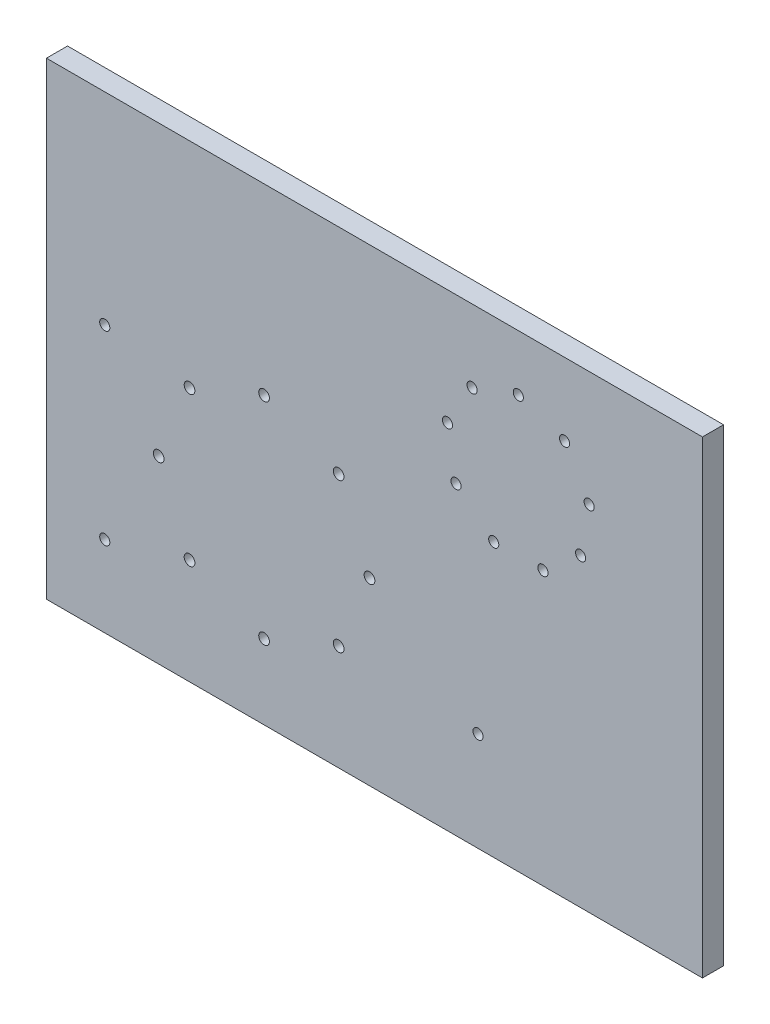
ISO-10303-21;
HEADER;
FILE_DESCRIPTION(('STEP AP214'),'2;1');
FILE_NAME('part.step','',(''),(''),'','','');
FILE_SCHEMA(('AUTOMOTIVE_DESIGN { 1 0 10303 214 1 1 1 1 }'));
ENDSEC;
DATA;
#1=APPLICATION_CONTEXT('core data for automotive mechanical design processes');
#2=APPLICATION_PROTOCOL_DEFINITION('international standard','automotive_design',2000,#1);
#3=PRODUCT_CONTEXT('',#1,'mechanical');
#4=PRODUCT('Part','Part','',(#3));
#5=PRODUCT_RELATED_PRODUCT_CATEGORY('part','',(#4));
#6=PRODUCT_DEFINITION_FORMATION('','',#4);
#7=PRODUCT_DEFINITION_CONTEXT('part definition',#1,'design');
#8=PRODUCT_DEFINITION('design','',#6,#7);
#9=PRODUCT_DEFINITION_SHAPE('','',#8);
#10=(LENGTH_UNIT() NAMED_UNIT(*) SI_UNIT(.MILLI.,.METRE.));
#11=(NAMED_UNIT(*) PLANE_ANGLE_UNIT() SI_UNIT($,.RADIAN.));
#12=(NAMED_UNIT(*) SI_UNIT($,.STERADIAN.) SOLID_ANGLE_UNIT());
#13=UNCERTAINTY_MEASURE_WITH_UNIT(LENGTH_MEASURE(1.E-05),#10,'distance_accuracy_value','');
#14=(GEOMETRIC_REPRESENTATION_CONTEXT(3) GLOBAL_UNCERTAINTY_ASSIGNED_CONTEXT((#13)) GLOBAL_UNIT_ASSIGNED_CONTEXT((#10,
#11,#12)) REPRESENTATION_CONTEXT('',''));
#15=CARTESIAN_POINT('',(0.,0.,0.));
#16=DIRECTION('',(0.,0.,1.));
#17=DIRECTION('',(1.,0.,0.));
#18=AXIS2_PLACEMENT_3D('',#15,#16,#17);
#19=CARTESIAN_POINT('',(0.,0.,0.));
#20=DIRECTION('',(0.,0.,1.));
#21=DIRECTION('',(1.,0.,0.));
#22=AXIS2_PLACEMENT_3D('',#19,#20,#21);
#23=PLANE('',#22);
#24=CARTESIAN_POINT('',(31.6090022979574,43.8536444541418,0.));
#25=DIRECTION('',(0.,0.,1.));
#26=DIRECTION('',(1.,0.,0.));
#27=AXIS2_PLACEMENT_3D('',#24,#25,#26);
#28=CIRCLE('',#27,2.74999999999999);
#29=CARTESIAN_POINT('',(34.3590022979574,43.8536444541418,0.));
#30=VERTEX_POINT('',#29);
#31=EDGE_CURVE('E276',#30,#30,#28,.T.);
#32=ORIENTED_EDGE('',*,*,#31,.T.);
#33=EDGE_LOOP('',(#32));
#34=FACE_BOUND('',#33,.T.);
#35=CARTESIAN_POINT('',(31.6090022979574,144.599742174142,0.));
#36=DIRECTION('',(0.,0.,1.));
#37=DIRECTION('',(1.,0.,0.));
#38=AXIS2_PLACEMENT_3D('',#35,#36,#37);
#39=CIRCLE('',#38,2.74999999999999);
#40=CARTESIAN_POINT('',(34.3590022979574,144.599742174142,0.));
#41=VERTEX_POINT('',#40);
#42=EDGE_CURVE('E286',#41,#41,#39,.T.);
#43=ORIENTED_EDGE('',*,*,#42,.T.);
#44=EDGE_LOOP('',(#43));
#45=FACE_BOUND('',#44,.T.);
#46=CARTESIAN_POINT('',(233.918988075957,53.7453572081418,0.));
#47=DIRECTION('',(0.,0.,1.));
#48=DIRECTION('',(1.,0.,0.));
#49=AXIS2_PLACEMENT_3D('',#46,#47,#48);
#50=CIRCLE('',#49,2.74999999999997);
#51=CARTESIAN_POINT('',(236.668988075957,53.7453572081418,0.));
#52=VERTEX_POINT('',#51);
#53=EDGE_CURVE('E292',#52,#52,#50,.T.);
#54=ORIENTED_EDGE('',*,*,#53,.T.);
#55=EDGE_LOOP('',(#54));
#56=FACE_BOUND('',#55,.T.);
#57=CARTESIAN_POINT('',(255.781782297957,223.823644432142,0.));
#58=DIRECTION('',(0.,0.,1.));
#59=DIRECTION('',(1.,0.,0.));
#60=AXIS2_PLACEMENT_3D('',#57,#58,#59);
#61=CIRCLE('',#60,2.74999999999997);
#62=CARTESIAN_POINT('',(258.531782297957,223.823644432142,0.));
#63=VERTEX_POINT('',#62);
#64=EDGE_CURVE('E298',#63,#63,#61,.T.);
#65=ORIENTED_EDGE('',*,*,#64,.T.);
#66=EDGE_LOOP('',(#65));
#67=FACE_BOUND('',#66,.T.);
#68=CARTESIAN_POINT('',(280.850499061592,214.699377718931,0.));
#69=DIRECTION('',(0.,0.,1.));
#70=DIRECTION('',(1.,0.,0.));
#71=AXIS2_PLACEMENT_3D('',#68,#69,#70);
#72=CIRCLE('',#71,2.74999999999997);
#73=CARTESIAN_POINT('',(283.600499061592,214.699377718931,0.));
#74=VERTEX_POINT('',#73);
#75=EDGE_CURVE('E304',#74,#74,#72,.T.);
#76=ORIENTED_EDGE('',*,*,#75,.T.);
#77=EDGE_LOOP('',(#76));
#78=FACE_BOUND('',#77,.T.);
#79=CARTESIAN_POINT('',(294.189284643768,191.595923379332,0.));
#80=DIRECTION('',(0.,0.,1.));
#81=DIRECTION('',(1.,0.,0.));
#82=AXIS2_PLACEMENT_3D('',#79,#80,#81);
#83=CIRCLE('',#82,2.74999999999997);
#84=CARTESIAN_POINT('',(296.939284643768,191.595923379332,0.));
#85=VERTEX_POINT('',#84);
#86=EDGE_CURVE('E310',#85,#85,#83,.T.);
#87=ORIENTED_EDGE('',*,*,#86,.T.);
#88=EDGE_LOOP('',(#87));
#89=FACE_BOUND('',#88,.T.);
#90=CARTESIAN_POINT('',(289.556773026498,165.323644465142,0.));
#91=DIRECTION('',(0.,0.,1.));
#92=DIRECTION('',(1.,0.,0.));
#93=AXIS2_PLACEMENT_3D('',#90,#91,#92);
#94=CIRCLE('',#93,2.74999999999997);
#95=CARTESIAN_POINT('',(292.306773026498,165.323644465142,0.));
#96=VERTEX_POINT('',#95);
#97=EDGE_CURVE('E316',#96,#96,#94,.T.);
#98=ORIENTED_EDGE('',*,*,#97,.T.);
#99=EDGE_LOOP('',(#98));
#100=FACE_BOUND('',#99,.T.);
#101=CARTESIAN_POINT('',(269.120567880134,148.175632264165,0.));
#102=DIRECTION('',(0.,0.,1.));
#103=DIRECTION('',(1.,0.,0.));
#104=AXIS2_PLACEMENT_3D('',#101,#102,#103);
#105=CIRCLE('',#104,2.74999999999997);
#106=CARTESIAN_POINT('',(271.870567880134,148.175632264165,0.));
#107=VERTEX_POINT('',#106);
#108=EDGE_CURVE('E322',#107,#107,#105,.T.);
#109=ORIENTED_EDGE('',*,*,#108,.T.);
#110=EDGE_LOOP('',(#109));
#111=FACE_BOUND('',#110,.T.);
#112=CARTESIAN_POINT('',(242.442996715781,148.175632264165,0.));
#113=DIRECTION('',(0.,0.,1.));
#114=DIRECTION('',(1.,0.,0.));
#115=AXIS2_PLACEMENT_3D('',#112,#113,#114);
#116=CIRCLE('',#115,2.74999999999997);
#117=CARTESIAN_POINT('',(245.192996715781,148.175632264165,0.));
#118=VERTEX_POINT('',#117);
#119=EDGE_CURVE('E328',#118,#118,#116,.T.);
#120=ORIENTED_EDGE('',*,*,#119,.T.);
#121=EDGE_LOOP('',(#120));
#122=FACE_BOUND('',#121,.T.);
#123=CARTESIAN_POINT('',(222.006791569417,165.323644465142,0.));
#124=DIRECTION('',(0.,0.,1.));
#125=DIRECTION('',(1.,0.,0.));
#126=AXIS2_PLACEMENT_3D('',#123,#124,#125);
#127=CIRCLE('',#126,2.74999999999997);
#128=CARTESIAN_POINT('',(224.756791569417,165.323644465142,0.));
#129=VERTEX_POINT('',#128);
#130=EDGE_CURVE('E334',#129,#129,#127,.T.);
#131=ORIENTED_EDGE('',*,*,#130,.T.);
#132=EDGE_LOOP('',(#131));
#133=FACE_BOUND('',#132,.T.);
#134=CARTESIAN_POINT('',(217.374279952147,191.595923379332,0.));
#135=DIRECTION('',(0.,0.,1.));
#136=DIRECTION('',(1.,0.,0.));
#137=AXIS2_PLACEMENT_3D('',#134,#135,#136);
#138=CIRCLE('',#137,2.74999999999997);
#139=CARTESIAN_POINT('',(220.124279952147,191.595923379332,0.));
#140=VERTEX_POINT('',#139);
#141=EDGE_CURVE('E340',#140,#140,#138,.T.);
#142=ORIENTED_EDGE('',*,*,#141,.T.);
#143=EDGE_LOOP('',(#142));
#144=FACE_BOUND('',#143,.T.);
#145=CARTESIAN_POINT('',(230.713065534325,214.699377718927,0.));
#146=DIRECTION('',(0.,0.,1.));
#147=DIRECTION('',(1.,0.,0.));
#148=AXIS2_PLACEMENT_3D('',#145,#146,#147);
#149=CIRCLE('',#148,2.74999999999997);
#150=CARTESIAN_POINT('',(233.463065534325,214.699377718927,0.));
#151=VERTEX_POINT('',#150);
#152=EDGE_CURVE('E346',#151,#151,#149,.T.);
#153=ORIENTED_EDGE('',*,*,#152,.T.);
#154=EDGE_LOOP('',(#153));
#155=FACE_BOUND('',#154,.T.);
#156=CARTESIAN_POINT('',(158.38015484277,138.036274418956,0.));
#157=DIRECTION('',(0.,0.,-1.));
#158=DIRECTION('',(-1.,0.,0.));
#159=AXIS2_PLACEMENT_3D('',#156,#157,#158);
#160=CIRCLE('',#159,6.11999999999999);
#161=CARTESIAN_POINT('',(152.26015484277,138.036274418956,0.));
#162=VERTEX_POINT('',#161);
#163=EDGE_CURVE('E349',#162,#162,#160,.T.);
#164=ORIENTED_EDGE('',*,*,#163,.F.);
#165=EDGE_LOOP('',(#164));
#166=FACE_BOUND('',#165,.T.);
#167=CARTESIAN_POINT('',(117.969002297957,154.775121874142,0.));
#168=DIRECTION('',(0.,0.,-1.));
#169=DIRECTION('',(-1.,0.,0.));
#170=AXIS2_PLACEMENT_3D('',#167,#168,#169);
#171=CIRCLE('',#170,6.12);
#172=CARTESIAN_POINT('',(111.849002297957,154.775121874142,0.));
#173=VERTEX_POINT('',#172);
#174=EDGE_CURVE('E361',#173,#173,#171,.T.);
#175=ORIENTED_EDGE('',*,*,#174,.F.);
#176=EDGE_LOOP('',(#175));
#177=FACE_BOUND('',#176,.T.);
#178=CARTESIAN_POINT('',(77.5578497531479,138.036274418951,0.));
#179=DIRECTION('',(0.,0.,-1.));
#180=DIRECTION('',(-1.,0.,0.));
#181=AXIS2_PLACEMENT_3D('',#178,#179,#180);
#182=CIRCLE('',#181,6.12);
#183=CARTESIAN_POINT('',(71.4378497531479,138.036274418951,0.));
#184=VERTEX_POINT('',#183);
#185=EDGE_CURVE('E373',#184,#184,#182,.T.);
#186=ORIENTED_EDGE('',*,*,#185,.F.);
#187=EDGE_LOOP('',(#186));
#188=FACE_BOUND('',#187,.T.);
#189=CARTESIAN_POINT('',(77.5578497531529,57.2139693293281,0.));
#190=DIRECTION('',(0.,0.,-1.));
#191=DIRECTION('',(-1.,0.,0.));
#192=AXIS2_PLACEMENT_3D('',#189,#190,#191);
#193=CIRCLE('',#192,6.12);
#194=CARTESIAN_POINT('',(71.4378497531529,57.2139693293281,0.));
#195=VERTEX_POINT('',#194);
#196=EDGE_CURVE('E397',#195,#195,#193,.T.);
#197=ORIENTED_EDGE('',*,*,#196,.F.);
#198=EDGE_LOOP('',(#197));
#199=FACE_BOUND('',#198,.T.);
#200=CARTESIAN_POINT('',(117.969002297965,40.4751218741419,0.));
#201=DIRECTION('',(0.,0.,-1.));
#202=DIRECTION('',(-1.,0.,0.));
#203=AXIS2_PLACEMENT_3D('',#200,#201,#202);
#204=CIRCLE('',#203,6.12);
#205=CARTESIAN_POINT('',(111.849002297965,40.4751218741419,0.));
#206=VERTEX_POINT('',#205);
#207=EDGE_CURVE('E409',#206,#206,#204,.T.);
#208=ORIENTED_EDGE('',*,*,#207,.F.);
#209=EDGE_LOOP('',(#208));
#210=FACE_BOUND('',#209,.T.);
#211=CARTESIAN_POINT('',(158.380154842775,57.2139693293333,0.));
#212=DIRECTION('',(0.,0.,-1.));
#213=DIRECTION('',(-1.,0.,0.));
#214=AXIS2_PLACEMENT_3D('',#211,#212,#213);
#215=CIRCLE('',#214,6.11999999999999);
#216=CARTESIAN_POINT('',(152.260154842775,57.2139693293333,0.));
#217=VERTEX_POINT('',#216);
#218=EDGE_CURVE('E421',#217,#217,#215,.T.);
#219=ORIENTED_EDGE('',*,*,#218,.F.);
#220=EDGE_LOOP('',(#219));
#221=FACE_BOUND('',#220,.T.);
#222=CARTESIAN_POINT('',(175.119002297961,97.6251218741457,0.));
#223=DIRECTION('',(0.,0.,-1.));
#224=DIRECTION('',(-1.,0.,0.));
#225=AXIS2_PLACEMENT_3D('',#222,#223,#224);
#226=CIRCLE('',#225,6.11999999999999);
#227=CARTESIAN_POINT('',(168.999002297961,97.6251218741457,0.));
#228=VERTEX_POINT('',#227);
#229=EDGE_CURVE('E433',#228,#228,#226,.T.);
#230=ORIENTED_EDGE('',*,*,#229,.F.);
#231=EDGE_LOOP('',(#230));
#232=FACE_BOUND('',#231,.T.);
#233=DIRECTION('',(1.,0.,0.));
#234=VECTOR('',#233,1.);
#235=CARTESIAN_POINT('',(0.,254.,0.));
#236=LINE('',#235,#234);
#237=CARTESIAN_POINT('',(0.,254.,0.));
#238=VERTEX_POINT('',#237);
#239=CARTESIAN_POINT('',(355.6,254.,0.));
#240=VERTEX_POINT('',#239);
#241=EDGE_CURVE('E99',#238,#240,#236,.T.);
#242=ORIENTED_EDGE('',*,*,#241,.T.);
#243=DIRECTION('',(0.,1.,0.));
#244=VECTOR('',#243,1.);
#245=CARTESIAN_POINT('',(355.6,0.,0.));
#246=LINE('',#245,#244);
#247=CARTESIAN_POINT('',(355.6,0.,0.));
#248=VERTEX_POINT('',#247);
#249=EDGE_CURVE('E102',#248,#240,#246,.T.);
#250=ORIENTED_EDGE('',*,*,#249,.F.);
#251=DIRECTION('',(1.,0.,0.));
#252=VECTOR('',#251,1.);
#253=CARTESIAN_POINT('',(0.,0.,0.));
#254=LINE('',#253,#252);
#255=CARTESIAN_POINT('',(0.,0.,0.));
#256=VERTEX_POINT('',#255);
#257=EDGE_CURVE('E87',#256,#248,#254,.T.);
#258=ORIENTED_EDGE('',*,*,#257,.F.);
#259=DIRECTION('',(0.,1.,0.));
#260=VECTOR('',#259,1.);
#261=CARTESIAN_POINT('',(0.,0.,0.));
#262=LINE('',#261,#260);
#263=EDGE_CURVE('E94',#256,#238,#262,.T.);
#264=ORIENTED_EDGE('',*,*,#263,.T.);
#265=EDGE_LOOP('',(#242,#250,#258,#264));
#266=FACE_BOUND('',#265,.T.);
#267=CARTESIAN_POINT('',(60.8190022979615,97.6251218741384,0.));
#268=DIRECTION('',(0.,0.,-1.));
#269=DIRECTION('',(-1.,0.,0.));
#270=AXIS2_PLACEMENT_3D('',#267,#268,#269);
#271=CIRCLE('',#270,6.12);
#272=CARTESIAN_POINT('',(54.6990022979615,97.6251218741384,0.));
#273=VERTEX_POINT('',#272);
#274=EDGE_CURVE('E385',#273,#273,#271,.T.);
#275=ORIENTED_EDGE('',*,*,#274,.F.);
#276=EDGE_LOOP('',(#275));
#277=FACE_BOUND('',#276,.T.);
#278=ADVANCED_FACE('F33',(#34,#45,#56,#67,#78,#89,#100,#111,#122,#133,#144,#155,#166,#177,#188,
#199,#210,#221,#232,#266,#277),#23,.F.);
#279=CARTESIAN_POINT('',(0.,254.,11.43));
#280=DIRECTION('',(0.,1.,0.));
#281=DIRECTION('',(0.,0.,1.));
#282=AXIS2_PLACEMENT_3D('',#279,#280,#281);
#283=PLANE('',#282);
#284=ORIENTED_EDGE('',*,*,#241,.F.);
#285=DIRECTION('',(0.,0.,-1.));
#286=VECTOR('',#285,1.);
#287=CARTESIAN_POINT('',(0.,254.,11.43));
#288=LINE('',#287,#286);
#289=CARTESIAN_POINT('',(0.,254.,11.43));
#290=VERTEX_POINT('',#289);
#291=EDGE_CURVE('E11',#290,#238,#288,.T.);
#292=ORIENTED_EDGE('',*,*,#291,.F.);
#293=DIRECTION('',(1.,0.,0.));
#294=VECTOR('',#293,1.);
#295=CARTESIAN_POINT('',(0.,254.,11.43));
#296=LINE('',#295,#294);
#297=CARTESIAN_POINT('',(355.6,254.,11.43));
#298=VERTEX_POINT('',#297);
#299=EDGE_CURVE('E92',#290,#298,#296,.T.);
#300=ORIENTED_EDGE('',*,*,#299,.T.);
#301=DIRECTION('',(0.,0.,-1.));
#302=VECTOR('',#301,1.);
#303=CARTESIAN_POINT('',(355.6,254.,11.43));
#304=LINE('',#303,#302);
#305=EDGE_CURVE('E37',#298,#240,#304,.T.);
#306=ORIENTED_EDGE('',*,*,#305,.T.);
#307=EDGE_LOOP('',(#284,#292,#300,#306));
#308=FACE_BOUND('',#307,.T.);
#309=ADVANCED_FACE('F35',(#308),#283,.T.);
#310=CARTESIAN_POINT('',(0.,0.,11.43));
#311=DIRECTION('',(-1.,0.,0.));
#312=DIRECTION('',(0.,0.,1.));
#313=AXIS2_PLACEMENT_3D('',#310,#311,#312);
#314=PLANE('',#313);
#315=ORIENTED_EDGE('',*,*,#263,.F.);
#316=DIRECTION('',(0.,0.,-1.));
#317=VECTOR('',#316,1.);
#318=CARTESIAN_POINT('',(0.,0.,11.43));
#319=LINE('',#318,#317);
#320=CARTESIAN_POINT('',(0.,0.,11.43));
#321=VERTEX_POINT('',#320);
#322=EDGE_CURVE('E43',#321,#256,#319,.T.);
#323=ORIENTED_EDGE('',*,*,#322,.F.);
#324=DIRECTION('',(0.,1.,0.));
#325=VECTOR('',#324,1.);
#326=CARTESIAN_POINT('',(0.,0.,11.43));
#327=LINE('',#326,#325);
#328=EDGE_CURVE('E82',#321,#290,#327,.T.);
#329=ORIENTED_EDGE('',*,*,#328,.T.);
#330=ORIENTED_EDGE('',*,*,#291,.T.);
#331=EDGE_LOOP('',(#315,#323,#329,#330));
#332=FACE_BOUND('',#331,.T.);
#333=ADVANCED_FACE('F110',(#332),#314,.T.);
#334=CARTESIAN_POINT('',(0.,0.,11.43));
#335=DIRECTION('',(0.,1.,0.));
#336=DIRECTION('',(0.,0.,1.));
#337=AXIS2_PLACEMENT_3D('',#334,#335,#336);
#338=PLANE('',#337);
#339=ORIENTED_EDGE('',*,*,#257,.T.);
#340=DIRECTION('',(0.,0.,-1.));
#341=VECTOR('',#340,1.);
#342=CARTESIAN_POINT('',(355.6,0.,11.43));
#343=LINE('',#342,#341);
#344=CARTESIAN_POINT('',(355.6,0.,11.43));
#345=VERTEX_POINT('',#344);
#346=EDGE_CURVE('E85',#345,#248,#343,.T.);
#347=ORIENTED_EDGE('',*,*,#346,.F.);
#348=DIRECTION('',(1.,0.,0.));
#349=VECTOR('',#348,1.);
#350=CARTESIAN_POINT('',(0.,0.,11.43));
#351=LINE('',#350,#349);
#352=EDGE_CURVE('E79',#321,#345,#351,.T.);
#353=ORIENTED_EDGE('',*,*,#352,.F.);
#354=ORIENTED_EDGE('',*,*,#322,.T.);
#355=EDGE_LOOP('',(#339,#347,#353,#354));
#356=FACE_BOUND('',#355,.T.);
#357=ADVANCED_FACE('F86',(#356),#338,.F.);
#358=CARTESIAN_POINT('',(355.6,0.,11.43));
#359=DIRECTION('',(-1.,0.,0.));
#360=DIRECTION('',(0.,-1.,0.));
#361=AXIS2_PLACEMENT_3D('',#358,#359,#360);
#362=PLANE('',#361);
#363=ORIENTED_EDGE('',*,*,#249,.T.);
#364=ORIENTED_EDGE('',*,*,#305,.F.);
#365=DIRECTION('',(0.,1.,0.));
#366=VECTOR('',#365,1.);
#367=CARTESIAN_POINT('',(355.6,0.,11.43));
#368=LINE('',#367,#366);
#369=EDGE_CURVE('E76',#345,#298,#368,.T.);
#370=ORIENTED_EDGE('',*,*,#369,.F.);
#371=ORIENTED_EDGE('',*,*,#346,.T.);
#372=EDGE_LOOP('',(#363,#364,#370,#371));
#373=FACE_BOUND('',#372,.T.);
#374=ADVANCED_FACE('F91',(#373),#362,.F.);
#375=CARTESIAN_POINT('',(0.,0.,11.43));
#376=DIRECTION('',(0.,0.,1.));
#377=DIRECTION('',(1.,0.,0.));
#378=AXIS2_PLACEMENT_3D('',#375,#376,#377);
#379=PLANE('',#378);
#380=CARTESIAN_POINT('',(31.6090022979574,43.8536444541418,11.43));
#381=DIRECTION('',(0.,0.,1.));
#382=DIRECTION('',(1.,0.,0.));
#383=AXIS2_PLACEMENT_3D('',#380,#381,#382);
#384=CIRCLE('',#383,2.74999999999999);
#385=CARTESIAN_POINT('',(34.3590022979574,43.8536444541418,11.43));
#386=VERTEX_POINT('',#385);
#387=EDGE_CURVE('E279',#386,#386,#384,.T.);
#388=ORIENTED_EDGE('',*,*,#387,.F.);
#389=EDGE_LOOP('',(#388));
#390=FACE_BOUND('',#389,.T.);
#391=CARTESIAN_POINT('',(31.6090022979574,144.599742174142,11.43));
#392=DIRECTION('',(0.,0.,1.));
#393=DIRECTION('',(1.,0.,0.));
#394=AXIS2_PLACEMENT_3D('',#391,#392,#393);
#395=CIRCLE('',#394,2.74999999999999);
#396=CARTESIAN_POINT('',(34.3590022979574,144.599742174142,11.43));
#397=VERTEX_POINT('',#396);
#398=EDGE_CURVE('E281',#397,#397,#395,.T.);
#399=ORIENTED_EDGE('',*,*,#398,.F.);
#400=EDGE_LOOP('',(#399));
#401=FACE_BOUND('',#400,.T.);
#402=CARTESIAN_POINT('',(233.918988075957,53.7453572081418,11.43));
#403=DIRECTION('',(0.,0.,1.));
#404=DIRECTION('',(1.,0.,0.));
#405=AXIS2_PLACEMENT_3D('',#402,#403,#404);
#406=CIRCLE('',#405,2.75);
#407=CARTESIAN_POINT('',(236.668988075957,53.7453572081418,11.43));
#408=VERTEX_POINT('',#407);
#409=EDGE_CURVE('E289',#408,#408,#406,.T.);
#410=ORIENTED_EDGE('',*,*,#409,.F.);
#411=EDGE_LOOP('',(#410));
#412=FACE_BOUND('',#411,.T.);
#413=CARTESIAN_POINT('',(255.781782297957,223.823644432142,11.43));
#414=DIRECTION('',(0.,0.,1.));
#415=DIRECTION('',(1.,0.,0.));
#416=AXIS2_PLACEMENT_3D('',#413,#414,#415);
#417=CIRCLE('',#416,2.74999999999997);
#418=CARTESIAN_POINT('',(258.531782297957,223.823644432142,11.43));
#419=VERTEX_POINT('',#418);
#420=EDGE_CURVE('E295',#419,#419,#417,.T.);
#421=ORIENTED_EDGE('',*,*,#420,.F.);
#422=EDGE_LOOP('',(#421));
#423=FACE_BOUND('',#422,.T.);
#424=CARTESIAN_POINT('',(280.850499061592,214.699377718931,11.43));
#425=DIRECTION('',(0.,0.,1.));
#426=DIRECTION('',(1.,0.,0.));
#427=AXIS2_PLACEMENT_3D('',#424,#425,#426);
#428=CIRCLE('',#427,2.74999999999997);
#429=CARTESIAN_POINT('',(283.600499061592,214.699377718931,11.43));
#430=VERTEX_POINT('',#429);
#431=EDGE_CURVE('E301',#430,#430,#428,.T.);
#432=ORIENTED_EDGE('',*,*,#431,.F.);
#433=EDGE_LOOP('',(#432));
#434=FACE_BOUND('',#433,.T.);
#435=CARTESIAN_POINT('',(294.189284643768,191.595923379332,11.43));
#436=DIRECTION('',(0.,0.,1.));
#437=DIRECTION('',(1.,0.,0.));
#438=AXIS2_PLACEMENT_3D('',#435,#436,#437);
#439=CIRCLE('',#438,2.74999999999997);
#440=CARTESIAN_POINT('',(296.939284643768,191.595923379332,11.43));
#441=VERTEX_POINT('',#440);
#442=EDGE_CURVE('E307',#441,#441,#439,.T.);
#443=ORIENTED_EDGE('',*,*,#442,.F.);
#444=EDGE_LOOP('',(#443));
#445=FACE_BOUND('',#444,.T.);
#446=CARTESIAN_POINT('',(289.556773026498,165.323644465142,11.43));
#447=DIRECTION('',(0.,0.,1.));
#448=DIRECTION('',(1.,0.,0.));
#449=AXIS2_PLACEMENT_3D('',#446,#447,#448);
#450=CIRCLE('',#449,2.74999999999997);
#451=CARTESIAN_POINT('',(292.306773026498,165.323644465142,11.43));
#452=VERTEX_POINT('',#451);
#453=EDGE_CURVE('E313',#452,#452,#450,.T.);
#454=ORIENTED_EDGE('',*,*,#453,.F.);
#455=EDGE_LOOP('',(#454));
#456=FACE_BOUND('',#455,.T.);
#457=CARTESIAN_POINT('',(269.120567880134,148.175632264165,11.43));
#458=DIRECTION('',(0.,0.,1.));
#459=DIRECTION('',(1.,0.,0.));
#460=AXIS2_PLACEMENT_3D('',#457,#458,#459);
#461=CIRCLE('',#460,2.74999999999997);
#462=CARTESIAN_POINT('',(271.870567880134,148.175632264165,11.43));
#463=VERTEX_POINT('',#462);
#464=EDGE_CURVE('E319',#463,#463,#461,.T.);
#465=ORIENTED_EDGE('',*,*,#464,.F.);
#466=EDGE_LOOP('',(#465));
#467=FACE_BOUND('',#466,.T.);
#468=CARTESIAN_POINT('',(242.442996715781,148.175632264165,11.43));
#469=DIRECTION('',(0.,0.,1.));
#470=DIRECTION('',(1.,0.,0.));
#471=AXIS2_PLACEMENT_3D('',#468,#469,#470);
#472=CIRCLE('',#471,2.74999999999997);
#473=CARTESIAN_POINT('',(245.192996715781,148.175632264165,11.43));
#474=VERTEX_POINT('',#473);
#475=EDGE_CURVE('E325',#474,#474,#472,.T.);
#476=ORIENTED_EDGE('',*,*,#475,.F.);
#477=EDGE_LOOP('',(#476));
#478=FACE_BOUND('',#477,.T.);
#479=CARTESIAN_POINT('',(222.006791569417,165.323644465142,11.43));
#480=DIRECTION('',(0.,0.,1.));
#481=DIRECTION('',(1.,0.,0.));
#482=AXIS2_PLACEMENT_3D('',#479,#480,#481);
#483=CIRCLE('',#482,2.74999999999997);
#484=CARTESIAN_POINT('',(224.756791569417,165.323644465142,11.43));
#485=VERTEX_POINT('',#484);
#486=EDGE_CURVE('E331',#485,#485,#483,.T.);
#487=ORIENTED_EDGE('',*,*,#486,.F.);
#488=EDGE_LOOP('',(#487));
#489=FACE_BOUND('',#488,.T.);
#490=CARTESIAN_POINT('',(217.374279952147,191.595923379332,11.43));
#491=DIRECTION('',(0.,0.,1.));
#492=DIRECTION('',(1.,0.,0.));
#493=AXIS2_PLACEMENT_3D('',#490,#491,#492);
#494=CIRCLE('',#493,2.75);
#495=CARTESIAN_POINT('',(220.124279952147,191.595923379332,11.43));
#496=VERTEX_POINT('',#495);
#497=EDGE_CURVE('E337',#496,#496,#494,.T.);
#498=ORIENTED_EDGE('',*,*,#497,.F.);
#499=EDGE_LOOP('',(#498));
#500=FACE_BOUND('',#499,.T.);
#501=CARTESIAN_POINT('',(230.713065534325,214.699377718927,11.43));
#502=DIRECTION('',(0.,0.,1.));
#503=DIRECTION('',(1.,0.,0.));
#504=AXIS2_PLACEMENT_3D('',#501,#502,#503);
#505=CIRCLE('',#504,2.74999999999997);
#506=CARTESIAN_POINT('',(233.463065534325,214.699377718927,11.43));
#507=VERTEX_POINT('',#506);
#508=EDGE_CURVE('E343',#507,#507,#505,.T.);
#509=ORIENTED_EDGE('',*,*,#508,.F.);
#510=EDGE_LOOP('',(#509));
#511=FACE_BOUND('',#510,.T.);
#512=CARTESIAN_POINT('',(158.38015484277,138.036274418956,11.43));
#513=DIRECTION('',(0.,0.,-1.));
#514=DIRECTION('',(-1.,0.,0.));
#515=AXIS2_PLACEMENT_3D('',#512,#513,#514);
#516=CIRCLE('',#515,2.89999999999999);
#517=CARTESIAN_POINT('',(155.48015484277,138.036274418956,11.43));
#518=VERTEX_POINT('',#517);
#519=EDGE_CURVE('E358',#518,#518,#516,.T.);
#520=ORIENTED_EDGE('',*,*,#519,.T.);
#521=EDGE_LOOP('',(#520));
#522=FACE_BOUND('',#521,.T.);
#523=CARTESIAN_POINT('',(117.969002297957,154.775121874142,11.43));
#524=DIRECTION('',(0.,0.,-1.));
#525=DIRECTION('',(-1.,0.,0.));
#526=AXIS2_PLACEMENT_3D('',#523,#524,#525);
#527=CIRCLE('',#526,2.9);
#528=CARTESIAN_POINT('',(115.069002297957,154.775121874142,11.43));
#529=VERTEX_POINT('',#528);
#530=EDGE_CURVE('E370',#529,#529,#527,.T.);
#531=ORIENTED_EDGE('',*,*,#530,.T.);
#532=EDGE_LOOP('',(#531));
#533=FACE_BOUND('',#532,.T.);
#534=CARTESIAN_POINT('',(77.5578497531479,138.036274418951,11.43));
#535=DIRECTION('',(0.,0.,-1.));
#536=DIRECTION('',(-1.,0.,0.));
#537=AXIS2_PLACEMENT_3D('',#534,#535,#536);
#538=CIRCLE('',#537,2.9);
#539=CARTESIAN_POINT('',(74.6578497531479,138.036274418951,11.43));
#540=VERTEX_POINT('',#539);
#541=EDGE_CURVE('E382',#540,#540,#538,.T.);
#542=ORIENTED_EDGE('',*,*,#541,.T.);
#543=EDGE_LOOP('',(#542));
#544=FACE_BOUND('',#543,.T.);
#545=CARTESIAN_POINT('',(60.8190022979615,97.6251218741384,11.43));
#546=DIRECTION('',(0.,0.,-1.));
#547=DIRECTION('',(-1.,0.,0.));
#548=AXIS2_PLACEMENT_3D('',#545,#546,#547);
#549=CIRCLE('',#548,2.9);
#550=CARTESIAN_POINT('',(57.9190022979615,97.6251218741384,11.43));
#551=VERTEX_POINT('',#550);
#552=EDGE_CURVE('E394',#551,#551,#549,.T.);
#553=ORIENTED_EDGE('',*,*,#552,.T.);
#554=EDGE_LOOP('',(#553));
#555=FACE_BOUND('',#554,.T.);
#556=CARTESIAN_POINT('',(77.5578497531529,57.2139693293281,11.43));
#557=DIRECTION('',(0.,0.,-1.));
#558=DIRECTION('',(-1.,0.,0.));
#559=AXIS2_PLACEMENT_3D('',#556,#557,#558);
#560=CIRCLE('',#559,2.9);
#561=CARTESIAN_POINT('',(74.6578497531529,57.2139693293281,11.43));
#562=VERTEX_POINT('',#561);
#563=EDGE_CURVE('E406',#562,#562,#560,.T.);
#564=ORIENTED_EDGE('',*,*,#563,.T.);
#565=EDGE_LOOP('',(#564));
#566=FACE_BOUND('',#565,.T.);
#567=CARTESIAN_POINT('',(117.969002297965,40.4751218741419,11.43));
#568=DIRECTION('',(0.,0.,-1.));
#569=DIRECTION('',(-1.,0.,0.));
#570=AXIS2_PLACEMENT_3D('',#567,#568,#569);
#571=CIRCLE('',#570,2.9);
#572=CARTESIAN_POINT('',(115.069002297965,40.4751218741419,11.43));
#573=VERTEX_POINT('',#572);
#574=EDGE_CURVE('E418',#573,#573,#571,.T.);
#575=ORIENTED_EDGE('',*,*,#574,.T.);
#576=EDGE_LOOP('',(#575));
#577=FACE_BOUND('',#576,.T.);
#578=CARTESIAN_POINT('',(158.380154842775,57.2139693293333,11.43));
#579=DIRECTION('',(0.,0.,-1.));
#580=DIRECTION('',(-1.,0.,0.));
#581=AXIS2_PLACEMENT_3D('',#578,#579,#580);
#582=CIRCLE('',#581,2.89999999999999);
#583=CARTESIAN_POINT('',(155.480154842775,57.2139693293333,11.43));
#584=VERTEX_POINT('',#583);
#585=EDGE_CURVE('E430',#584,#584,#582,.T.);
#586=ORIENTED_EDGE('',*,*,#585,.T.);
#587=EDGE_LOOP('',(#586));
#588=FACE_BOUND('',#587,.T.);
#589=CARTESIAN_POINT('',(175.119002297961,97.6251218741457,11.43));
#590=DIRECTION('',(0.,0.,-1.));
#591=DIRECTION('',(-1.,0.,0.));
#592=AXIS2_PLACEMENT_3D('',#589,#590,#591);
#593=CIRCLE('',#592,2.89999999999999);
#594=CARTESIAN_POINT('',(172.219002297961,97.6251218741457,11.43));
#595=VERTEX_POINT('',#594);
#596=EDGE_CURVE('E103',#595,#595,#593,.T.);
#597=ORIENTED_EDGE('',*,*,#596,.T.);
#598=EDGE_LOOP('',(#597));
#599=FACE_BOUND('',#598,.T.);
#600=ORIENTED_EDGE('',*,*,#299,.F.);
#601=ORIENTED_EDGE('',*,*,#328,.F.);
#602=ORIENTED_EDGE('',*,*,#352,.T.);
#603=ORIENTED_EDGE('',*,*,#369,.T.);
#604=EDGE_LOOP('',(#600,#601,#602,#603));
#605=FACE_BOUND('',#604,.T.);
#606=ADVANCED_FACE('F81',(#390,#401,#412,#423,#434,#445,#456,#467,#478,#489,#500,#511,#522,#533,
#544,#555,#566,#577,#588,#599,#605),#379,.T.);
#607=CARTESIAN_POINT('',(175.119002297961,97.6251218741457,0.));
#608=DIRECTION('',(0.,0.,-1.));
#609=DIRECTION('',(-1.,0.,0.));
#610=AXIS2_PLACEMENT_3D('',#607,#608,#609);
#611=CYLINDRICAL_SURFACE('',#610,2.9);
#612=ORIENTED_EDGE('',*,*,#596,.F.);
#613=EDGE_LOOP('',(#612));
#614=FACE_BOUND('',#613,.T.);
#615=CARTESIAN_POINT('',(175.119002297961,97.6251218741457,3.58));
#616=DIRECTION('',(0.,0.,-1.));
#617=DIRECTION('',(-1.,0.,0.));
#618=AXIS2_PLACEMENT_3D('',#615,#616,#617);
#619=CIRCLE('',#618,2.90000000000001);
#620=CARTESIAN_POINT('',(172.219002297961,97.6251218741457,3.58));
#621=VERTEX_POINT('',#620);
#622=EDGE_CURVE('E439',#621,#621,#619,.T.);
#623=ORIENTED_EDGE('',*,*,#622,.T.);
#624=EDGE_LOOP('',(#623));
#625=FACE_BOUND('',#624,.T.);
#626=ADVANCED_FACE('F128',(#614,#625),#611,.F.);
#627=CARTESIAN_POINT('',(178.019002297961,97.6251218741457,3.58));
#628=DIRECTION('',(0.,0.,1.));
#629=DIRECTION('',(1.,0.,0.));
#630=AXIS2_PLACEMENT_3D('',#627,#628,#629);
#631=PLANE('',#630);
#632=ORIENTED_EDGE('',*,*,#622,.F.);
#633=EDGE_LOOP('',(#632));
#634=FACE_BOUND('',#633,.T.);
#635=CARTESIAN_POINT('',(175.119002297961,97.6251218741457,3.58));
#636=DIRECTION('',(0.,0.,-1.));
#637=DIRECTION('',(-1.,0.,0.));
#638=AXIS2_PLACEMENT_3D('',#635,#636,#637);
#639=CIRCLE('',#638,6.11999999999999);
#640=CARTESIAN_POINT('',(168.999002297961,97.6251218741457,3.58));
#641=VERTEX_POINT('',#640);
#642=EDGE_CURVE('E436',#641,#641,#639,.T.);
#643=ORIENTED_EDGE('',*,*,#642,.T.);
#644=EDGE_LOOP('',(#643));
#645=FACE_BOUND('',#644,.T.);
#646=ADVANCED_FACE('F132',(#634,#645),#631,.F.);
#647=CARTESIAN_POINT('',(175.119002297961,97.6251218741457,0.));
#648=DIRECTION('',(0.,0.,-1.));
#649=DIRECTION('',(-1.,0.,0.));
#650=AXIS2_PLACEMENT_3D('',#647,#648,#649);
#651=CYLINDRICAL_SURFACE('',#650,6.11999999999999);
#652=ORIENTED_EDGE('',*,*,#642,.F.);
#653=EDGE_LOOP('',(#652));
#654=FACE_BOUND('',#653,.T.);
#655=ORIENTED_EDGE('',*,*,#229,.T.);
#656=EDGE_LOOP('',(#655));
#657=FACE_BOUND('',#656,.T.);
#658=ADVANCED_FACE('F136',(#654,#657),#651,.F.);
#659=CARTESIAN_POINT('',(158.380154842775,57.2139693293333,0.));
#660=DIRECTION('',(0.,0.,-1.));
#661=DIRECTION('',(-1.,0.,0.));
#662=AXIS2_PLACEMENT_3D('',#659,#660,#661);
#663=CYLINDRICAL_SURFACE('',#662,2.9);
#664=ORIENTED_EDGE('',*,*,#585,.F.);
#665=EDGE_LOOP('',(#664));
#666=FACE_BOUND('',#665,.T.);
#667=CARTESIAN_POINT('',(158.380154842775,57.2139693293333,3.58));
#668=DIRECTION('',(0.,0.,-1.));
#669=DIRECTION('',(-1.,0.,0.));
#670=AXIS2_PLACEMENT_3D('',#667,#668,#669);
#671=CIRCLE('',#670,2.90000000000001);
#672=CARTESIAN_POINT('',(155.480154842775,57.2139693293333,3.58));
#673=VERTEX_POINT('',#672);
#674=EDGE_CURVE('E427',#673,#673,#671,.T.);
#675=ORIENTED_EDGE('',*,*,#674,.T.);
#676=EDGE_LOOP('',(#675));
#677=FACE_BOUND('',#676,.T.);
#678=ADVANCED_FACE('F140',(#666,#677),#663,.F.);
#679=CARTESIAN_POINT('',(161.280154842775,57.2139693293333,3.58));
#680=DIRECTION('',(0.,0.,1.));
#681=DIRECTION('',(1.,0.,0.));
#682=AXIS2_PLACEMENT_3D('',#679,#680,#681);
#683=PLANE('',#682);
#684=ORIENTED_EDGE('',*,*,#674,.F.);
#685=EDGE_LOOP('',(#684));
#686=FACE_BOUND('',#685,.T.);
#687=CARTESIAN_POINT('',(158.380154842775,57.2139693293333,3.58));
#688=DIRECTION('',(0.,0.,-1.));
#689=DIRECTION('',(-1.,0.,0.));
#690=AXIS2_PLACEMENT_3D('',#687,#688,#689);
#691=CIRCLE('',#690,6.11999999999999);
#692=CARTESIAN_POINT('',(152.260154842775,57.2139693293333,3.58));
#693=VERTEX_POINT('',#692);
#694=EDGE_CURVE('E424',#693,#693,#691,.T.);
#695=ORIENTED_EDGE('',*,*,#694,.T.);
#696=EDGE_LOOP('',(#695));
#697=FACE_BOUND('',#696,.T.);
#698=ADVANCED_FACE('F144',(#686,#697),#683,.F.);
#699=CARTESIAN_POINT('',(158.380154842775,57.2139693293333,0.));
#700=DIRECTION('',(0.,0.,-1.));
#701=DIRECTION('',(-1.,0.,0.));
#702=AXIS2_PLACEMENT_3D('',#699,#700,#701);
#703=CYLINDRICAL_SURFACE('',#702,6.11999999999999);
#704=ORIENTED_EDGE('',*,*,#694,.F.);
#705=EDGE_LOOP('',(#704));
#706=FACE_BOUND('',#705,.T.);
#707=ORIENTED_EDGE('',*,*,#218,.T.);
#708=EDGE_LOOP('',(#707));
#709=FACE_BOUND('',#708,.T.);
#710=ADVANCED_FACE('F148',(#706,#709),#703,.F.);
#711=CARTESIAN_POINT('',(117.969002297965,40.4751218741419,0.));
#712=DIRECTION('',(0.,0.,-1.));
#713=DIRECTION('',(-1.,0.,0.));
#714=AXIS2_PLACEMENT_3D('',#711,#712,#713);
#715=CYLINDRICAL_SURFACE('',#714,2.9);
#716=ORIENTED_EDGE('',*,*,#574,.F.);
#717=EDGE_LOOP('',(#716));
#718=FACE_BOUND('',#717,.T.);
#719=CARTESIAN_POINT('',(117.969002297965,40.4751218741419,3.58));
#720=DIRECTION('',(0.,0.,-1.));
#721=DIRECTION('',(-1.,0.,0.));
#722=AXIS2_PLACEMENT_3D('',#719,#720,#721);
#723=CIRCLE('',#722,2.9);
#724=CARTESIAN_POINT('',(115.069002297965,40.4751218741419,3.58));
#725=VERTEX_POINT('',#724);
#726=EDGE_CURVE('E415',#725,#725,#723,.T.);
#727=ORIENTED_EDGE('',*,*,#726,.T.);
#728=EDGE_LOOP('',(#727));
#729=FACE_BOUND('',#728,.T.);
#730=ADVANCED_FACE('F152',(#718,#729),#715,.F.);
#731=CARTESIAN_POINT('',(120.869002297965,40.4751218741419,3.58));
#732=DIRECTION('',(0.,0.,1.));
#733=DIRECTION('',(1.,0.,0.));
#734=AXIS2_PLACEMENT_3D('',#731,#732,#733);
#735=PLANE('',#734);
#736=ORIENTED_EDGE('',*,*,#726,.F.);
#737=EDGE_LOOP('',(#736));
#738=FACE_BOUND('',#737,.T.);
#739=CARTESIAN_POINT('',(117.969002297965,40.4751218741419,3.58));
#740=DIRECTION('',(0.,0.,-1.));
#741=DIRECTION('',(-1.,0.,0.));
#742=AXIS2_PLACEMENT_3D('',#739,#740,#741);
#743=CIRCLE('',#742,6.12);
#744=CARTESIAN_POINT('',(111.849002297965,40.4751218741419,3.58));
#745=VERTEX_POINT('',#744);
#746=EDGE_CURVE('E412',#745,#745,#743,.T.);
#747=ORIENTED_EDGE('',*,*,#746,.T.);
#748=EDGE_LOOP('',(#747));
#749=FACE_BOUND('',#748,.T.);
#750=ADVANCED_FACE('F156',(#738,#749),#735,.F.);
#751=CARTESIAN_POINT('',(117.969002297965,40.4751218741419,0.));
#752=DIRECTION('',(0.,0.,-1.));
#753=DIRECTION('',(-1.,0.,0.));
#754=AXIS2_PLACEMENT_3D('',#751,#752,#753);
#755=CYLINDRICAL_SURFACE('',#754,6.12);
#756=ORIENTED_EDGE('',*,*,#746,.F.);
#757=EDGE_LOOP('',(#756));
#758=FACE_BOUND('',#757,.T.);
#759=ORIENTED_EDGE('',*,*,#207,.T.);
#760=EDGE_LOOP('',(#759));
#761=FACE_BOUND('',#760,.T.);
#762=ADVANCED_FACE('F160',(#758,#761),#755,.F.);
#763=CARTESIAN_POINT('',(77.5578497531529,57.2139693293281,0.));
#764=DIRECTION('',(0.,0.,-1.));
#765=DIRECTION('',(-1.,0.,0.));
#766=AXIS2_PLACEMENT_3D('',#763,#764,#765);
#767=CYLINDRICAL_SURFACE('',#766,2.9);
#768=ORIENTED_EDGE('',*,*,#563,.F.);
#769=EDGE_LOOP('',(#768));
#770=FACE_BOUND('',#769,.T.);
#771=CARTESIAN_POINT('',(77.5578497531529,57.2139693293281,3.58));
#772=DIRECTION('',(0.,0.,-1.));
#773=DIRECTION('',(-1.,0.,0.));
#774=AXIS2_PLACEMENT_3D('',#771,#772,#773);
#775=CIRCLE('',#774,2.9);
#776=CARTESIAN_POINT('',(74.6578497531529,57.2139693293281,3.58));
#777=VERTEX_POINT('',#776);
#778=EDGE_CURVE('E403',#777,#777,#775,.T.);
#779=ORIENTED_EDGE('',*,*,#778,.T.);
#780=EDGE_LOOP('',(#779));
#781=FACE_BOUND('',#780,.T.);
#782=ADVANCED_FACE('F164',(#770,#781),#767,.F.);
#783=CARTESIAN_POINT('',(80.4578497531529,57.2139693293281,3.58));
#784=DIRECTION('',(0.,0.,1.));
#785=DIRECTION('',(1.,0.,0.));
#786=AXIS2_PLACEMENT_3D('',#783,#784,#785);
#787=PLANE('',#786);
#788=ORIENTED_EDGE('',*,*,#778,.F.);
#789=EDGE_LOOP('',(#788));
#790=FACE_BOUND('',#789,.T.);
#791=CARTESIAN_POINT('',(77.5578497531529,57.2139693293281,3.58));
#792=DIRECTION('',(0.,0.,-1.));
#793=DIRECTION('',(-1.,0.,0.));
#794=AXIS2_PLACEMENT_3D('',#791,#792,#793);
#795=CIRCLE('',#794,6.12);
#796=CARTESIAN_POINT('',(71.4378497531529,57.2139693293281,3.58));
#797=VERTEX_POINT('',#796);
#798=EDGE_CURVE('E400',#797,#797,#795,.T.);
#799=ORIENTED_EDGE('',*,*,#798,.T.);
#800=EDGE_LOOP('',(#799));
#801=FACE_BOUND('',#800,.T.);
#802=ADVANCED_FACE('F168',(#790,#801),#787,.F.);
#803=CARTESIAN_POINT('',(77.5578497531529,57.2139693293281,0.));
#804=DIRECTION('',(0.,0.,-1.));
#805=DIRECTION('',(-1.,0.,0.));
#806=AXIS2_PLACEMENT_3D('',#803,#804,#805);
#807=CYLINDRICAL_SURFACE('',#806,6.12);
#808=ORIENTED_EDGE('',*,*,#798,.F.);
#809=EDGE_LOOP('',(#808));
#810=FACE_BOUND('',#809,.T.);
#811=ORIENTED_EDGE('',*,*,#196,.T.);
#812=EDGE_LOOP('',(#811));
#813=FACE_BOUND('',#812,.T.);
#814=ADVANCED_FACE('F172',(#810,#813),#807,.F.);
#815=CARTESIAN_POINT('',(60.8190022979615,97.6251218741384,0.));
#816=DIRECTION('',(0.,0.,-1.));
#817=DIRECTION('',(-1.,0.,0.));
#818=AXIS2_PLACEMENT_3D('',#815,#816,#817);
#819=CYLINDRICAL_SURFACE('',#818,2.9);
#820=ORIENTED_EDGE('',*,*,#552,.F.);
#821=EDGE_LOOP('',(#820));
#822=FACE_BOUND('',#821,.T.);
#823=CARTESIAN_POINT('',(60.8190022979615,97.6251218741384,3.58));
#824=DIRECTION('',(0.,0.,-1.));
#825=DIRECTION('',(-1.,0.,0.));
#826=AXIS2_PLACEMENT_3D('',#823,#824,#825);
#827=CIRCLE('',#826,2.9);
#828=CARTESIAN_POINT('',(57.9190022979615,97.6251218741384,3.58));
#829=VERTEX_POINT('',#828);
#830=EDGE_CURVE('E391',#829,#829,#827,.T.);
#831=ORIENTED_EDGE('',*,*,#830,.T.);
#832=EDGE_LOOP('',(#831));
#833=FACE_BOUND('',#832,.T.);
#834=ADVANCED_FACE('F176',(#822,#833),#819,.F.);
#835=CARTESIAN_POINT('',(63.7190022979615,97.6251218741384,3.58));
#836=DIRECTION('',(0.,0.,1.));
#837=DIRECTION('',(1.,0.,0.));
#838=AXIS2_PLACEMENT_3D('',#835,#836,#837);
#839=PLANE('',#838);
#840=ORIENTED_EDGE('',*,*,#830,.F.);
#841=EDGE_LOOP('',(#840));
#842=FACE_BOUND('',#841,.T.);
#843=CARTESIAN_POINT('',(60.8190022979615,97.6251218741384,3.58));
#844=DIRECTION('',(0.,0.,-1.));
#845=DIRECTION('',(-1.,0.,0.));
#846=AXIS2_PLACEMENT_3D('',#843,#844,#845);
#847=CIRCLE('',#846,6.12);
#848=CARTESIAN_POINT('',(54.6990022979615,97.6251218741384,3.58));
#849=VERTEX_POINT('',#848);
#850=EDGE_CURVE('E388',#849,#849,#847,.T.);
#851=ORIENTED_EDGE('',*,*,#850,.T.);
#852=EDGE_LOOP('',(#851));
#853=FACE_BOUND('',#852,.T.);
#854=ADVANCED_FACE('F180',(#842,#853),#839,.F.);
#855=CARTESIAN_POINT('',(60.8190022979615,97.6251218741384,0.));
#856=DIRECTION('',(0.,0.,-1.));
#857=DIRECTION('',(-1.,0.,0.));
#858=AXIS2_PLACEMENT_3D('',#855,#856,#857);
#859=CYLINDRICAL_SURFACE('',#858,6.12);
#860=ORIENTED_EDGE('',*,*,#850,.F.);
#861=EDGE_LOOP('',(#860));
#862=FACE_BOUND('',#861,.T.);
#863=ORIENTED_EDGE('',*,*,#274,.T.);
#864=EDGE_LOOP('',(#863));
#865=FACE_BOUND('',#864,.T.);
#866=ADVANCED_FACE('F184',(#862,#865),#859,.F.);
#867=CARTESIAN_POINT('',(77.5578497531479,138.036274418951,0.));
#868=DIRECTION('',(0.,0.,-1.));
#869=DIRECTION('',(-1.,0.,0.));
#870=AXIS2_PLACEMENT_3D('',#867,#868,#869);
#871=CYLINDRICAL_SURFACE('',#870,2.9);
#872=ORIENTED_EDGE('',*,*,#541,.F.);
#873=EDGE_LOOP('',(#872));
#874=FACE_BOUND('',#873,.T.);
#875=CARTESIAN_POINT('',(77.5578497531479,138.036274418951,3.58));
#876=DIRECTION('',(0.,0.,-1.));
#877=DIRECTION('',(-1.,0.,0.));
#878=AXIS2_PLACEMENT_3D('',#875,#876,#877);
#879=CIRCLE('',#878,2.9);
#880=CARTESIAN_POINT('',(74.6578497531479,138.036274418951,3.58));
#881=VERTEX_POINT('',#880);
#882=EDGE_CURVE('E379',#881,#881,#879,.T.);
#883=ORIENTED_EDGE('',*,*,#882,.T.);
#884=EDGE_LOOP('',(#883));
#885=FACE_BOUND('',#884,.T.);
#886=ADVANCED_FACE('F188',(#874,#885),#871,.F.);
#887=CARTESIAN_POINT('',(80.4578497531479,138.036274418951,3.58));
#888=DIRECTION('',(0.,0.,1.));
#889=DIRECTION('',(1.,0.,0.));
#890=AXIS2_PLACEMENT_3D('',#887,#888,#889);
#891=PLANE('',#890);
#892=ORIENTED_EDGE('',*,*,#882,.F.);
#893=EDGE_LOOP('',(#892));
#894=FACE_BOUND('',#893,.T.);
#895=CARTESIAN_POINT('',(77.5578497531479,138.036274418951,3.58));
#896=DIRECTION('',(0.,0.,-1.));
#897=DIRECTION('',(-1.,0.,0.));
#898=AXIS2_PLACEMENT_3D('',#895,#896,#897);
#899=CIRCLE('',#898,6.12);
#900=CARTESIAN_POINT('',(71.4378497531479,138.036274418951,3.58));
#901=VERTEX_POINT('',#900);
#902=EDGE_CURVE('E376',#901,#901,#899,.T.);
#903=ORIENTED_EDGE('',*,*,#902,.T.);
#904=EDGE_LOOP('',(#903));
#905=FACE_BOUND('',#904,.T.);
#906=ADVANCED_FACE('F192',(#894,#905),#891,.F.);
#907=CARTESIAN_POINT('',(77.5578497531479,138.036274418951,0.));
#908=DIRECTION('',(0.,0.,-1.));
#909=DIRECTION('',(-1.,0.,0.));
#910=AXIS2_PLACEMENT_3D('',#907,#908,#909);
#911=CYLINDRICAL_SURFACE('',#910,6.12);
#912=ORIENTED_EDGE('',*,*,#902,.F.);
#913=EDGE_LOOP('',(#912));
#914=FACE_BOUND('',#913,.T.);
#915=ORIENTED_EDGE('',*,*,#185,.T.);
#916=EDGE_LOOP('',(#915));
#917=FACE_BOUND('',#916,.T.);
#918=ADVANCED_FACE('F196',(#914,#917),#911,.F.);
#919=CARTESIAN_POINT('',(117.969002297957,154.775121874142,0.));
#920=DIRECTION('',(0.,0.,-1.));
#921=DIRECTION('',(-1.,0.,0.));
#922=AXIS2_PLACEMENT_3D('',#919,#920,#921);
#923=CYLINDRICAL_SURFACE('',#922,2.9);
#924=ORIENTED_EDGE('',*,*,#530,.F.);
#925=EDGE_LOOP('',(#924));
#926=FACE_BOUND('',#925,.T.);
#927=CARTESIAN_POINT('',(117.969002297957,154.775121874142,3.58));
#928=DIRECTION('',(0.,0.,-1.));
#929=DIRECTION('',(-1.,0.,0.));
#930=AXIS2_PLACEMENT_3D('',#927,#928,#929);
#931=CIRCLE('',#930,2.9);
#932=CARTESIAN_POINT('',(115.069002297957,154.775121874142,3.58));
#933=VERTEX_POINT('',#932);
#934=EDGE_CURVE('E367',#933,#933,#931,.T.);
#935=ORIENTED_EDGE('',*,*,#934,.T.);
#936=EDGE_LOOP('',(#935));
#937=FACE_BOUND('',#936,.T.);
#938=ADVANCED_FACE('F200',(#926,#937),#923,.F.);
#939=CARTESIAN_POINT('',(120.869002297957,154.775121874142,3.58));
#940=DIRECTION('',(0.,0.,1.));
#941=DIRECTION('',(1.,0.,0.));
#942=AXIS2_PLACEMENT_3D('',#939,#940,#941);
#943=PLANE('',#942);
#944=ORIENTED_EDGE('',*,*,#934,.F.);
#945=EDGE_LOOP('',(#944));
#946=FACE_BOUND('',#945,.T.);
#947=CARTESIAN_POINT('',(117.969002297957,154.775121874142,3.58));
#948=DIRECTION('',(0.,0.,-1.));
#949=DIRECTION('',(-1.,0.,0.));
#950=AXIS2_PLACEMENT_3D('',#947,#948,#949);
#951=CIRCLE('',#950,6.12);
#952=CARTESIAN_POINT('',(111.849002297957,154.775121874142,3.58));
#953=VERTEX_POINT('',#952);
#954=EDGE_CURVE('E364',#953,#953,#951,.T.);
#955=ORIENTED_EDGE('',*,*,#954,.T.);
#956=EDGE_LOOP('',(#955));
#957=FACE_BOUND('',#956,.T.);
#958=ADVANCED_FACE('F204',(#946,#957),#943,.F.);
#959=CARTESIAN_POINT('',(117.969002297957,154.775121874142,0.));
#960=DIRECTION('',(0.,0.,-1.));
#961=DIRECTION('',(-1.,0.,0.));
#962=AXIS2_PLACEMENT_3D('',#959,#960,#961);
#963=CYLINDRICAL_SURFACE('',#962,6.12);
#964=ORIENTED_EDGE('',*,*,#954,.F.);
#965=EDGE_LOOP('',(#964));
#966=FACE_BOUND('',#965,.T.);
#967=ORIENTED_EDGE('',*,*,#174,.T.);
#968=EDGE_LOOP('',(#967));
#969=FACE_BOUND('',#968,.T.);
#970=ADVANCED_FACE('F208',(#966,#969),#963,.F.);
#971=CARTESIAN_POINT('',(158.38015484277,138.036274418956,0.));
#972=DIRECTION('',(0.,0.,-1.));
#973=DIRECTION('',(-1.,0.,0.));
#974=AXIS2_PLACEMENT_3D('',#971,#972,#973);
#975=CYLINDRICAL_SURFACE('',#974,2.9);
#976=ORIENTED_EDGE('',*,*,#519,.F.);
#977=EDGE_LOOP('',(#976));
#978=FACE_BOUND('',#977,.T.);
#979=CARTESIAN_POINT('',(158.38015484277,138.036274418956,3.58));
#980=DIRECTION('',(0.,0.,-1.));
#981=DIRECTION('',(-1.,0.,0.));
#982=AXIS2_PLACEMENT_3D('',#979,#980,#981);
#983=CIRCLE('',#982,2.90000000000001);
#984=CARTESIAN_POINT('',(155.48015484277,138.036274418956,3.58));
#985=VERTEX_POINT('',#984);
#986=EDGE_CURVE('E355',#985,#985,#983,.T.);
#987=ORIENTED_EDGE('',*,*,#986,.T.);
#988=EDGE_LOOP('',(#987));
#989=FACE_BOUND('',#988,.T.);
#990=ADVANCED_FACE('F212',(#978,#989),#975,.F.);
#991=CARTESIAN_POINT('',(161.28015484277,138.036274418956,3.58));
#992=DIRECTION('',(0.,0.,1.));
#993=DIRECTION('',(1.,0.,0.));
#994=AXIS2_PLACEMENT_3D('',#991,#992,#993);
#995=PLANE('',#994);
#996=ORIENTED_EDGE('',*,*,#986,.F.);
#997=EDGE_LOOP('',(#996));
#998=FACE_BOUND('',#997,.T.);
#999=CARTESIAN_POINT('',(158.38015484277,138.036274418956,3.58));
#1000=DIRECTION('',(0.,0.,-1.));
#1001=DIRECTION('',(-1.,0.,0.));
#1002=AXIS2_PLACEMENT_3D('',#999,#1000,#1001);
#1003=CIRCLE('',#1002,6.11999999999999);
#1004=CARTESIAN_POINT('',(152.26015484277,138.036274418956,3.58));
#1005=VERTEX_POINT('',#1004);
#1006=EDGE_CURVE('E352',#1005,#1005,#1003,.T.);
#1007=ORIENTED_EDGE('',*,*,#1006,.T.);
#1008=EDGE_LOOP('',(#1007));
#1009=FACE_BOUND('',#1008,.T.);
#1010=ADVANCED_FACE('F216',(#998,#1009),#995,.F.);
#1011=CARTESIAN_POINT('',(158.38015484277,138.036274418956,0.));
#1012=DIRECTION('',(0.,0.,-1.));
#1013=DIRECTION('',(-1.,0.,0.));
#1014=AXIS2_PLACEMENT_3D('',#1011,#1012,#1013);
#1015=CYLINDRICAL_SURFACE('',#1014,6.11999999999999);
#1016=ORIENTED_EDGE('',*,*,#1006,.F.);
#1017=EDGE_LOOP('',(#1016));
#1018=FACE_BOUND('',#1017,.T.);
#1019=ORIENTED_EDGE('',*,*,#163,.T.);
#1020=EDGE_LOOP('',(#1019));
#1021=FACE_BOUND('',#1020,.T.);
#1022=ADVANCED_FACE('F220',(#1018,#1021),#1015,.F.);
#1023=CARTESIAN_POINT('',(230.713065534325,214.699377718927,11.43));
#1024=DIRECTION('',(0.,0.,1.));
#1025=DIRECTION('',(1.,0.,0.));
#1026=AXIS2_PLACEMENT_3D('',#1023,#1024,#1025);
#1027=CYLINDRICAL_SURFACE('',#1026,2.74999999999997);
#1028=ORIENTED_EDGE('',*,*,#152,.F.);
#1029=EDGE_LOOP('',(#1028));
#1030=FACE_BOUND('',#1029,.T.);
#1031=ORIENTED_EDGE('',*,*,#508,.T.);
#1032=EDGE_LOOP('',(#1031));
#1033=FACE_BOUND('',#1032,.T.);
#1034=ADVANCED_FACE('F224',(#1030,#1033),#1027,.F.);
#1035=CARTESIAN_POINT('',(217.374279952147,191.595923379332,11.43));
#1036=DIRECTION('',(0.,0.,1.));
#1037=DIRECTION('',(1.,0.,0.));
#1038=AXIS2_PLACEMENT_3D('',#1035,#1036,#1037);
#1039=CYLINDRICAL_SURFACE('',#1038,2.74999999999999);
#1040=ORIENTED_EDGE('',*,*,#141,.F.);
#1041=EDGE_LOOP('',(#1040));
#1042=FACE_BOUND('',#1041,.T.);
#1043=ORIENTED_EDGE('',*,*,#497,.T.);
#1044=EDGE_LOOP('',(#1043));
#1045=FACE_BOUND('',#1044,.T.);
#1046=ADVANCED_FACE('F228',(#1042,#1045),#1039,.F.);
#1047=CARTESIAN_POINT('',(222.006791569417,165.323644465142,11.43));
#1048=DIRECTION('',(0.,0.,1.));
#1049=DIRECTION('',(1.,0.,0.));
#1050=AXIS2_PLACEMENT_3D('',#1047,#1048,#1049);
#1051=CYLINDRICAL_SURFACE('',#1050,2.74999999999997);
#1052=ORIENTED_EDGE('',*,*,#130,.F.);
#1053=EDGE_LOOP('',(#1052));
#1054=FACE_BOUND('',#1053,.T.);
#1055=ORIENTED_EDGE('',*,*,#486,.T.);
#1056=EDGE_LOOP('',(#1055));
#1057=FACE_BOUND('',#1056,.T.);
#1058=ADVANCED_FACE('F232',(#1054,#1057),#1051,.F.);
#1059=CARTESIAN_POINT('',(242.442996715781,148.175632264165,11.43));
#1060=DIRECTION('',(0.,0.,1.));
#1061=DIRECTION('',(1.,0.,0.));
#1062=AXIS2_PLACEMENT_3D('',#1059,#1060,#1061);
#1063=CYLINDRICAL_SURFACE('',#1062,2.74999999999997);
#1064=ORIENTED_EDGE('',*,*,#119,.F.);
#1065=EDGE_LOOP('',(#1064));
#1066=FACE_BOUND('',#1065,.T.);
#1067=ORIENTED_EDGE('',*,*,#475,.T.);
#1068=EDGE_LOOP('',(#1067));
#1069=FACE_BOUND('',#1068,.T.);
#1070=ADVANCED_FACE('F236',(#1066,#1069),#1063,.F.);
#1071=CARTESIAN_POINT('',(269.120567880134,148.175632264165,11.43));
#1072=DIRECTION('',(0.,0.,1.));
#1073=DIRECTION('',(1.,0.,0.));
#1074=AXIS2_PLACEMENT_3D('',#1071,#1072,#1073);
#1075=CYLINDRICAL_SURFACE('',#1074,2.74999999999997);
#1076=ORIENTED_EDGE('',*,*,#108,.F.);
#1077=EDGE_LOOP('',(#1076));
#1078=FACE_BOUND('',#1077,.T.);
#1079=ORIENTED_EDGE('',*,*,#464,.T.);
#1080=EDGE_LOOP('',(#1079));
#1081=FACE_BOUND('',#1080,.T.);
#1082=ADVANCED_FACE('F240',(#1078,#1081),#1075,.F.);
#1083=CARTESIAN_POINT('',(289.556773026498,165.323644465142,11.43));
#1084=DIRECTION('',(0.,0.,1.));
#1085=DIRECTION('',(1.,0.,0.));
#1086=AXIS2_PLACEMENT_3D('',#1083,#1084,#1085);
#1087=CYLINDRICAL_SURFACE('',#1086,2.74999999999997);
#1088=ORIENTED_EDGE('',*,*,#97,.F.);
#1089=EDGE_LOOP('',(#1088));
#1090=FACE_BOUND('',#1089,.T.);
#1091=ORIENTED_EDGE('',*,*,#453,.T.);
#1092=EDGE_LOOP('',(#1091));
#1093=FACE_BOUND('',#1092,.T.);
#1094=ADVANCED_FACE('F244',(#1090,#1093),#1087,.F.);
#1095=CARTESIAN_POINT('',(294.189284643768,191.595923379332,11.43));
#1096=DIRECTION('',(0.,0.,1.));
#1097=DIRECTION('',(1.,0.,0.));
#1098=AXIS2_PLACEMENT_3D('',#1095,#1096,#1097);
#1099=CYLINDRICAL_SURFACE('',#1098,2.74999999999997);
#1100=ORIENTED_EDGE('',*,*,#86,.F.);
#1101=EDGE_LOOP('',(#1100));
#1102=FACE_BOUND('',#1101,.T.);
#1103=ORIENTED_EDGE('',*,*,#442,.T.);
#1104=EDGE_LOOP('',(#1103));
#1105=FACE_BOUND('',#1104,.T.);
#1106=ADVANCED_FACE('F248',(#1102,#1105),#1099,.F.);
#1107=CARTESIAN_POINT('',(280.850499061592,214.699377718931,11.43));
#1108=DIRECTION('',(0.,0.,1.));
#1109=DIRECTION('',(1.,0.,0.));
#1110=AXIS2_PLACEMENT_3D('',#1107,#1108,#1109);
#1111=CYLINDRICAL_SURFACE('',#1110,2.74999999999997);
#1112=ORIENTED_EDGE('',*,*,#75,.F.);
#1113=EDGE_LOOP('',(#1112));
#1114=FACE_BOUND('',#1113,.T.);
#1115=ORIENTED_EDGE('',*,*,#431,.T.);
#1116=EDGE_LOOP('',(#1115));
#1117=FACE_BOUND('',#1116,.T.);
#1118=ADVANCED_FACE('F252',(#1114,#1117),#1111,.F.);
#1119=CARTESIAN_POINT('',(255.781782297957,223.823644432142,11.43));
#1120=DIRECTION('',(0.,0.,1.));
#1121=DIRECTION('',(1.,0.,0.));
#1122=AXIS2_PLACEMENT_3D('',#1119,#1120,#1121);
#1123=CYLINDRICAL_SURFACE('',#1122,2.74999999999997);
#1124=ORIENTED_EDGE('',*,*,#64,.F.);
#1125=EDGE_LOOP('',(#1124));
#1126=FACE_BOUND('',#1125,.T.);
#1127=ORIENTED_EDGE('',*,*,#420,.T.);
#1128=EDGE_LOOP('',(#1127));
#1129=FACE_BOUND('',#1128,.T.);
#1130=ADVANCED_FACE('F256',(#1126,#1129),#1123,.F.);
#1131=CARTESIAN_POINT('',(233.918988075957,53.7453572081418,11.43));
#1132=DIRECTION('',(0.,0.,1.));
#1133=DIRECTION('',(1.,0.,0.));
#1134=AXIS2_PLACEMENT_3D('',#1131,#1132,#1133);
#1135=CYLINDRICAL_SURFACE('',#1134,2.74999999999999);
#1136=ORIENTED_EDGE('',*,*,#53,.F.);
#1137=EDGE_LOOP('',(#1136));
#1138=FACE_BOUND('',#1137,.T.);
#1139=ORIENTED_EDGE('',*,*,#409,.T.);
#1140=EDGE_LOOP('',(#1139));
#1141=FACE_BOUND('',#1140,.T.);
#1142=ADVANCED_FACE('F260',(#1138,#1141),#1135,.F.);
#1143=CARTESIAN_POINT('',(31.6090022979574,144.599742174142,11.43));
#1144=DIRECTION('',(0.,0.,1.));
#1145=DIRECTION('',(1.,0.,0.));
#1146=AXIS2_PLACEMENT_3D('',#1143,#1144,#1145);
#1147=CYLINDRICAL_SURFACE('',#1146,2.74999999999999);
#1148=ORIENTED_EDGE('',*,*,#42,.F.);
#1149=EDGE_LOOP('',(#1148));
#1150=FACE_BOUND('',#1149,.T.);
#1151=ORIENTED_EDGE('',*,*,#398,.T.);
#1152=EDGE_LOOP('',(#1151));
#1153=FACE_BOUND('',#1152,.T.);
#1154=ADVANCED_FACE('F264',(#1150,#1153),#1147,.F.);
#1155=CARTESIAN_POINT('',(31.6090022979574,43.8536444541418,11.43));
#1156=DIRECTION('',(0.,0.,1.));
#1157=DIRECTION('',(1.,0.,0.));
#1158=AXIS2_PLACEMENT_3D('',#1155,#1156,#1157);
#1159=CYLINDRICAL_SURFACE('',#1158,2.74999999999999);
#1160=ORIENTED_EDGE('',*,*,#31,.F.);
#1161=EDGE_LOOP('',(#1160));
#1162=FACE_BOUND('',#1161,.T.);
#1163=ORIENTED_EDGE('',*,*,#387,.T.);
#1164=EDGE_LOOP('',(#1163));
#1165=FACE_BOUND('',#1164,.T.);
#1166=ADVANCED_FACE('F268',(#1162,#1165),#1159,.F.);
#1167=CLOSED_SHELL('',(#278,#309,#333,#357,#374,#606,#626,#646,#658,#678,#698,#710,#730,#750,
#762,#782,#802,#814,#834,#854,#866,#886,#906,#918,#938,#958,#970,#990,#1010,#1022,#1034,#1046,
#1058,#1070,#1082,#1094,#1106,#1118,#1130,#1142,#1154,#1166));
#1168=MANIFOLD_SOLID_BREP('B2',#1167);
#1169=ADVANCED_BREP_SHAPE_REPRESENTATION('',(#18,#1168),#14);
#1170=SHAPE_DEFINITION_REPRESENTATION(#9,#1169);
ENDSEC;
END-ISO-10303-21;
